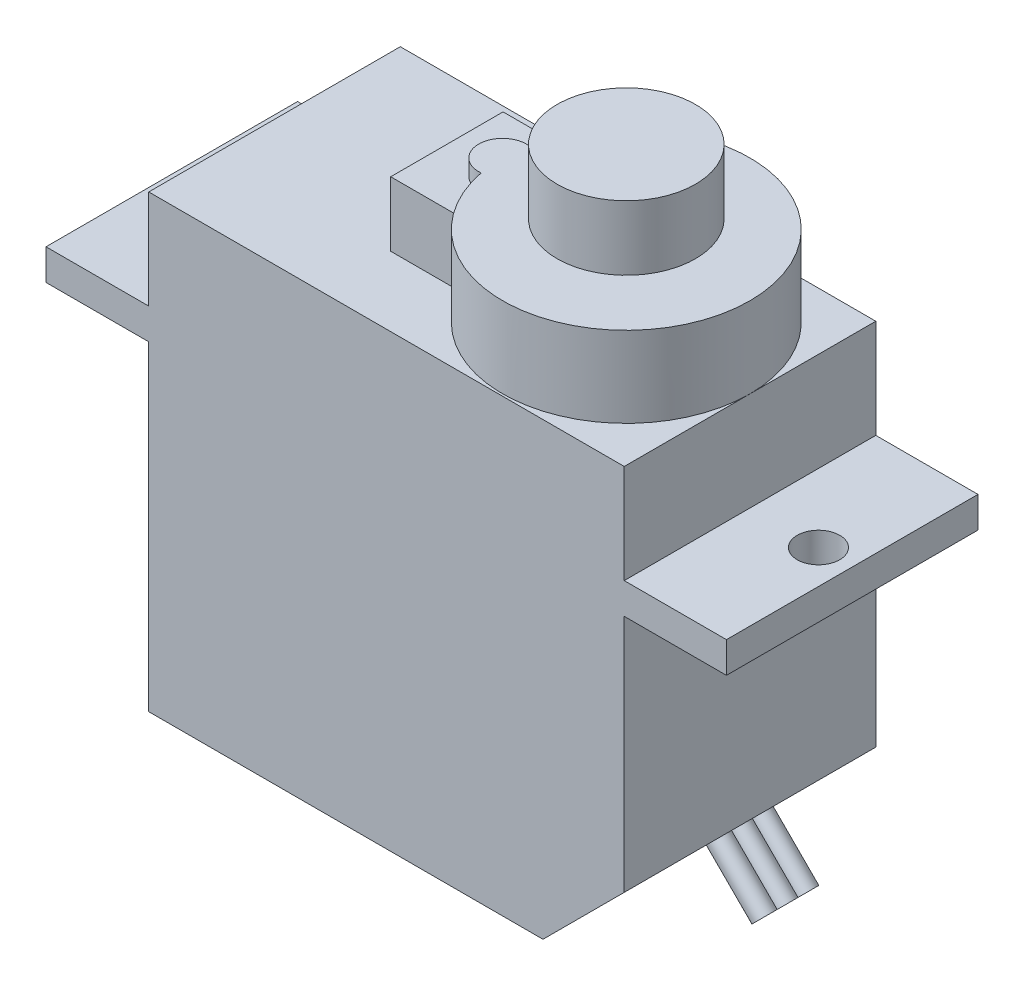
ISO-10303-21;
HEADER;
FILE_DESCRIPTION(('STEP AP214'),'2;1');
FILE_NAME('part.step','',(''),(''),'','','');
FILE_SCHEMA(('AUTOMOTIVE_DESIGN { 1 0 10303 214 1 1 1 1 }'));
ENDSEC;
DATA;
#1=APPLICATION_CONTEXT('core data for automotive mechanical design processes');
#2=APPLICATION_PROTOCOL_DEFINITION('international standard','automotive_design',2000,#1);
#3=PRODUCT_CONTEXT('',#1,'mechanical');
#4=PRODUCT('Part','Part','',(#3));
#5=PRODUCT_RELATED_PRODUCT_CATEGORY('part','',(#4));
#6=PRODUCT_DEFINITION_FORMATION('','',#4);
#7=PRODUCT_DEFINITION_CONTEXT('part definition',#1,'design');
#8=PRODUCT_DEFINITION('design','',#6,#7);
#9=PRODUCT_DEFINITION_SHAPE('','',#8);
#10=(LENGTH_UNIT() NAMED_UNIT(*) SI_UNIT(.MILLI.,.METRE.));
#11=(NAMED_UNIT(*) PLANE_ANGLE_UNIT() SI_UNIT($,.RADIAN.));
#12=(NAMED_UNIT(*) SI_UNIT($,.STERADIAN.) SOLID_ANGLE_UNIT());
#13=UNCERTAINTY_MEASURE_WITH_UNIT(LENGTH_MEASURE(1.E-05),#10,'distance_accuracy_value','');
#14=(GEOMETRIC_REPRESENTATION_CONTEXT(3) GLOBAL_UNCERTAINTY_ASSIGNED_CONTEXT((#13)) GLOBAL_UNIT_ASSIGNED_CONTEXT((#10,
#11,#12)) REPRESENTATION_CONTEXT('',''));
#15=CARTESIAN_POINT('',(0.,0.,0.));
#16=DIRECTION('',(0.,0.,1.));
#17=DIRECTION('',(1.,0.,0.));
#18=AXIS2_PLACEMENT_3D('',#15,#16,#17);
#19=CARTESIAN_POINT('',(19.12,0.,-12.2));
#20=DIRECTION('',(0.707106781186549,-0.707106781186546,0.));
#21=DIRECTION('',(0.707106781186546,0.707106781186549,0.));
#22=AXIS2_PLACEMENT_3D('',#19,#20,#21);
#23=PLANE('',#22);
#24=CARTESIAN_POINT('',(22.5615705813706,3.44157058137057,-6.1));
#25=DIRECTION('',(0.707106781186549,-0.707106781186546,0.));
#26=DIRECTION('',(0.707106781186546,0.707106781186549,0.));
#27=AXIS2_PLACEMENT_3D('',#24,#25,#26);
#28=CIRCLE('',#27,0.500000000000001);
#29=CARTESIAN_POINT('',(22.9151239719638,3.79512397196384,-6.1));
#30=VERTEX_POINT('',#29);
#31=EDGE_CURVE('E346',#30,#30,#28,.T.);
#32=ORIENTED_EDGE('',*,*,#31,.F.);
#33=EDGE_LOOP('',(#32));
#34=FACE_BOUND('',#33,.T.);
#35=DIRECTION('',(0.707106781186546,0.707106781186549,0.));
#36=VECTOR('',#35,1.);
#37=CARTESIAN_POINT('',(19.12,0.,0.));
#38=LINE('',#37,#36);
#39=CARTESIAN_POINT('',(19.12,0.,0.));
#40=VERTEX_POINT('',#39);
#41=CARTESIAN_POINT('',(23.06,3.94,0.));
#42=VERTEX_POINT('',#41);
#43=EDGE_CURVE('E297',#40,#42,#38,.T.);
#44=ORIENTED_EDGE('',*,*,#43,.F.);
#45=DIRECTION('',(0.,0.,1.));
#46=VECTOR('',#45,1.);
#47=CARTESIAN_POINT('',(19.12,0.,-12.2));
#48=LINE('',#47,#46);
#49=CARTESIAN_POINT('',(19.12,0.,-12.2));
#50=VERTEX_POINT('',#49);
#51=EDGE_CURVE('E316',#50,#40,#48,.T.);
#52=ORIENTED_EDGE('',*,*,#51,.F.);
#53=DIRECTION('',(0.707106781186546,0.707106781186549,0.));
#54=VECTOR('',#53,1.);
#55=CARTESIAN_POINT('',(19.12,0.,-12.2));
#56=LINE('',#55,#54);
#57=CARTESIAN_POINT('',(23.06,3.94,-12.2));
#58=VERTEX_POINT('',#57);
#59=EDGE_CURVE('E280',#50,#58,#56,.T.);
#60=ORIENTED_EDGE('',*,*,#59,.T.);
#61=DIRECTION('',(0.,0.,1.));
#62=VECTOR('',#61,1.);
#63=CARTESIAN_POINT('',(23.06,3.94,-12.2));
#64=LINE('',#63,#62);
#65=EDGE_CURVE('E314',#58,#42,#64,.T.);
#66=ORIENTED_EDGE('',*,*,#65,.T.);
#67=EDGE_LOOP('',(#44,#52,#60,#66));
#68=FACE_BOUND('',#67,.T.);
#69=CARTESIAN_POINT('',(22.5615705813706,3.44157058137056,-5.09));
#70=DIRECTION('',(0.707106781186549,-0.707106781186546,0.));
#71=DIRECTION('',(0.707106781186546,0.707106781186549,0.));
#72=AXIS2_PLACEMENT_3D('',#69,#70,#71);
#73=CIRCLE('',#72,0.500000000000001);
#74=CARTESIAN_POINT('',(22.9151239719638,3.79512397196384,-5.09));
#75=VERTEX_POINT('',#74);
#76=EDGE_CURVE('E340',#75,#75,#73,.T.);
#77=ORIENTED_EDGE('',*,*,#76,.F.);
#78=EDGE_LOOP('',(#77));
#79=FACE_BOUND('',#78,.T.);
#80=CARTESIAN_POINT('',(22.5615705813706,3.44157058137057,-7.11));
#81=DIRECTION('',(0.707106781186549,-0.707106781186546,0.));
#82=DIRECTION('',(0.707106781186546,0.707106781186549,0.));
#83=AXIS2_PLACEMENT_3D('',#80,#81,#82);
#84=CIRCLE('',#83,0.500000000000001);
#85=CARTESIAN_POINT('',(22.9151239719638,3.79512397196384,-7.11));
#86=VERTEX_POINT('',#85);
#87=EDGE_CURVE('E352',#86,#86,#84,.T.);
#88=ORIENTED_EDGE('',*,*,#87,.F.);
#89=EDGE_LOOP('',(#88));
#90=FACE_BOUND('',#89,.T.);
#91=ADVANCED_FACE('F33',(#34,#68,#79,#90),#23,.T.);
#92=CARTESIAN_POINT('',(17.06,28.51,-6.1));
#93=DIRECTION('',(0.,-1.,0.));
#94=DIRECTION('',(0.,0.,-1.));
#95=AXIS2_PLACEMENT_3D('',#92,#93,#94);
#96=CYLINDRICAL_SURFACE('',#95,2.345);
#97=CARTESIAN_POINT('',(17.06,25.74,-6.1));
#98=DIRECTION('',(0.,1.,0.));
#99=DIRECTION('',(0.,0.,1.));
#100=AXIS2_PLACEMENT_3D('',#97,#98,#99);
#101=CIRCLE('',#100,2.345);
#102=CARTESIAN_POINT('',(17.06,25.74,-3.755));
#103=VERTEX_POINT('',#102);
#104=EDGE_CURVE('E186',#103,#103,#101,.F.);
#105=ORIENTED_EDGE('',*,*,#104,.F.);
#106=EDGE_LOOP('',(#105));
#107=FACE_BOUND('',#106,.T.);
#108=CARTESIAN_POINT('',(17.06,26.18,-6.1));
#109=DIRECTION('',(0.,1.,0.));
#110=DIRECTION('',(0.,0.,1.));
#111=AXIS2_PLACEMENT_3D('',#108,#109,#110);
#112=CIRCLE('',#111,2.345);
#113=CARTESIAN_POINT('',(17.06,26.18,-3.755));
#114=VERTEX_POINT('',#113);
#115=EDGE_CURVE('E11',#114,#114,#112,.T.);
#116=ORIENTED_EDGE('',*,*,#115,.F.);
#117=EDGE_LOOP('',(#116));
#118=FACE_BOUND('',#117,.T.);
#119=ADVANCED_FACE('F368',(#107,#118),#96,.T.);
#120=CARTESIAN_POINT('',(17.06,25.74,-6.1));
#121=DIRECTION('',(0.,1.,0.));
#122=DIRECTION('',(0.,0.,1.));
#123=AXIS2_PLACEMENT_3D('',#120,#121,#122);
#124=PLANE('',#123);
#125=CARTESIAN_POINT('',(17.06,25.74,-6.1));
#126=DIRECTION('',(0.,1.,0.));
#127=DIRECTION('',(0.,0.,1.));
#128=AXIS2_PLACEMENT_3D('',#125,#126,#127);
#129=CIRCLE('',#128,6.);
#130=CARTESIAN_POINT('',(11.1721333333333,25.74,-4.94543249848458));
#131=VERTEX_POINT('',#130);
#132=CARTESIAN_POINT('',(11.1721333333333,25.74,-7.25456750151542));
#133=VERTEX_POINT('',#132);
#134=EDGE_CURVE('E265',#131,#133,#129,.T.);
#135=ORIENTED_EDGE('',*,*,#134,.T.);
#136=CARTESIAN_POINT('',(11.06,25.74,-6.1));
#137=DIRECTION('',(0.,1.,0.));
#138=DIRECTION('',(0.,0.,1.));
#139=AXIS2_PLACEMENT_3D('',#136,#137,#138);
#140=CIRCLE('',#139,1.16);
#141=EDGE_CURVE('E203',#133,#131,#140,.T.);
#142=ORIENTED_EDGE('',*,*,#141,.T.);
#143=EDGE_LOOP('',(#135,#142));
#144=FACE_BOUND('',#143,.T.);
#145=ORIENTED_EDGE('',*,*,#104,.T.);
#146=EDGE_LOOP('',(#145));
#147=FACE_BOUND('',#146,.T.);
#148=ADVANCED_FACE('F374',(#144,#147),#124,.T.);
#149=CARTESIAN_POINT('',(0.,21.83,-12.2));
#150=DIRECTION('',(0.,1.,0.));
#151=DIRECTION('',(0.,0.,1.));
#152=AXIS2_PLACEMENT_3D('',#149,#150,#151);
#153=PLANE('',#152);
#154=CARTESIAN_POINT('',(17.06,21.83,-6.1));
#155=DIRECTION('',(0.,1.,0.));
#156=DIRECTION('',(0.,0.,1.));
#157=AXIS2_PLACEMENT_3D('',#154,#155,#156);
#158=CIRCLE('',#157,6.);
#159=CARTESIAN_POINT('',(23.06,21.83,-6.1));
#160=VERTEX_POINT('',#159);
#161=CARTESIAN_POINT('',(11.7144995557011,21.83,-3.375));
#162=VERTEX_POINT('',#161);
#163=EDGE_CURVE('E269',#160,#162,#158,.F.);
#164=ORIENTED_EDGE('',*,*,#163,.T.);
#165=DIRECTION('',(-1.,0.,0.));
#166=VECTOR('',#165,1.);
#167=CARTESIAN_POINT('',(0.,21.83,-3.375));
#168=LINE('',#167,#166);
#169=CARTESIAN_POINT('',(8.36,21.83,-3.375));
#170=VERTEX_POINT('',#169);
#171=EDGE_CURVE('E201',#162,#170,#168,.T.);
#172=ORIENTED_EDGE('',*,*,#171,.T.);
#173=DIRECTION('',(0.,0.,-1.));
#174=VECTOR('',#173,1.);
#175=CARTESIAN_POINT('',(8.36,21.83,-12.2));
#176=LINE('',#175,#174);
#177=CARTESIAN_POINT('',(8.36,21.83,-8.825));
#178=VERTEX_POINT('',#177);
#179=EDGE_CURVE('E190',#170,#178,#176,.T.);
#180=ORIENTED_EDGE('',*,*,#179,.T.);
#181=DIRECTION('',(1.,0.,0.));
#182=VECTOR('',#181,1.);
#183=CARTESIAN_POINT('',(0.,21.83,-8.825));
#184=LINE('',#183,#182);
#185=CARTESIAN_POINT('',(11.7144995557011,21.83,-8.825));
#186=VERTEX_POINT('',#185);
#187=EDGE_CURVE('E198',#178,#186,#184,.T.);
#188=ORIENTED_EDGE('',*,*,#187,.T.);
#189=EDGE_CURVE('E268',#186,#160,#158,.F.);
#190=ORIENTED_EDGE('',*,*,#189,.T.);
#191=DIRECTION('',(0.,0.,1.));
#192=VECTOR('',#191,1.);
#193=CARTESIAN_POINT('',(23.06,21.83,-12.2));
#194=LINE('',#193,#192);
#195=CARTESIAN_POINT('',(23.06,21.83,-12.2));
#196=VERTEX_POINT('',#195);
#197=EDGE_CURVE('E310',#196,#160,#194,.T.);
#198=ORIENTED_EDGE('',*,*,#197,.F.);
#199=DIRECTION('',(-1.,0.,0.));
#200=VECTOR('',#199,1.);
#201=CARTESIAN_POINT('',(0.,21.83,-12.2));
#202=LINE('',#201,#200);
#203=CARTESIAN_POINT('',(0.,21.83,-12.2));
#204=VERTEX_POINT('',#203);
#205=EDGE_CURVE('E287',#196,#204,#202,.T.);
#206=ORIENTED_EDGE('',*,*,#205,.T.);
#207=DIRECTION('',(0.,0.,1.));
#208=VECTOR('',#207,1.);
#209=CARTESIAN_POINT('',(0.,21.83,-12.2));
#210=LINE('',#209,#208);
#211=CARTESIAN_POINT('',(0.,21.83,0.));
#212=VERTEX_POINT('',#211);
#213=EDGE_CURVE('E307',#204,#212,#210,.T.);
#214=ORIENTED_EDGE('',*,*,#213,.T.);
#215=DIRECTION('',(-1.,0.,0.));
#216=VECTOR('',#215,1.);
#217=CARTESIAN_POINT('',(0.,21.83,0.));
#218=LINE('',#217,#216);
#219=CARTESIAN_POINT('',(23.06,21.83,0.));
#220=VERTEX_POINT('',#219);
#221=EDGE_CURVE('E304',#220,#212,#218,.T.);
#222=ORIENTED_EDGE('',*,*,#221,.F.);
#223=EDGE_CURVE('E313',#160,#220,#194,.T.);
#224=ORIENTED_EDGE('',*,*,#223,.F.);
#225=EDGE_LOOP('',(#164,#172,#180,#188,#190,#198,#206,#214,#222,#224));
#226=FACE_BOUND('',#225,.T.);
#227=ADVANCED_FACE('F432',(#226),#153,.T.);
#228=CARTESIAN_POINT('',(17.06,25.74,-6.1));
#229=DIRECTION('',(0.,-1.,0.));
#230=DIRECTION('',(0.,0.,-1.));
#231=AXIS2_PLACEMENT_3D('',#228,#229,#230);
#232=CYLINDRICAL_SURFACE('',#231,6.);
#233=DIRECTION('',(0.,-1.,0.));
#234=VECTOR('',#233,1.);
#235=CARTESIAN_POINT('',(11.7144995557011,25.74,-8.825));
#236=LINE('',#235,#234);
#237=CARTESIAN_POINT('',(11.7144995557011,24.96,-8.825));
#238=VERTEX_POINT('',#237);
#239=EDGE_CURVE('E322',#238,#186,#236,.T.);
#240=ORIENTED_EDGE('',*,*,#239,.F.);
#241=CARTESIAN_POINT('',(17.06,24.96,-6.1));
#242=DIRECTION('',(0.,1.,0.));
#243=DIRECTION('',(0.,0.,1.));
#244=AXIS2_PLACEMENT_3D('',#241,#242,#243);
#245=CIRCLE('',#244,6.);
#246=CARTESIAN_POINT('',(11.1721333333333,24.96,-7.25456750151542));
#247=VERTEX_POINT('',#246);
#248=EDGE_CURVE('E193',#238,#247,#245,.T.);
#249=ORIENTED_EDGE('',*,*,#248,.T.);
#250=DIRECTION('',(0.,-1.,0.));
#251=VECTOR('',#250,1.);
#252=CARTESIAN_POINT('',(11.1721333333333,21.37,-7.25456750151542));
#253=LINE('',#252,#251);
#254=EDGE_CURVE('E206',#133,#247,#253,.T.);
#255=ORIENTED_EDGE('',*,*,#254,.F.);
#256=ORIENTED_EDGE('',*,*,#134,.F.);
#257=DIRECTION('',(0.,-1.,0.));
#258=VECTOR('',#257,1.);
#259=CARTESIAN_POINT('',(11.1721333333333,21.37,-4.94543249848458));
#260=LINE('',#259,#258);
#261=CARTESIAN_POINT('',(11.1721333333333,24.96,-4.94543249848458));
#262=VERTEX_POINT('',#261);
#263=EDGE_CURVE('E57',#262,#131,#260,.F.);
#264=ORIENTED_EDGE('',*,*,#263,.F.);
#265=CARTESIAN_POINT('',(11.7144995557011,24.96,-3.375));
#266=VERTEX_POINT('',#265);
#267=EDGE_CURVE('E50',#262,#266,#245,.T.);
#268=ORIENTED_EDGE('',*,*,#267,.T.);
#269=DIRECTION('',(0.,-1.,0.));
#270=VECTOR('',#269,1.);
#271=CARTESIAN_POINT('',(11.7144995557011,25.74,-3.375));
#272=LINE('',#271,#270);
#273=EDGE_CURVE('E176',#162,#266,#272,.F.);
#274=ORIENTED_EDGE('',*,*,#273,.F.);
#275=ORIENTED_EDGE('',*,*,#163,.F.);
#276=ORIENTED_EDGE('',*,*,#189,.F.);
#277=EDGE_LOOP('',(#240,#249,#255,#256,#264,#268,#274,#275,#276));
#278=FACE_BOUND('',#277,.T.);
#279=ADVANCED_FACE('F498',(#278),#232,.T.);
#280=CARTESIAN_POINT('',(0.,0.,-12.2));
#281=DIRECTION('',(-1.,0.,0.));
#282=DIRECTION('',(0.,0.,1.));
#283=AXIS2_PLACEMENT_3D('',#280,#281,#282);
#284=PLANE('',#283);
#285=DIRECTION('',(0.,0.,-1.));
#286=VECTOR('',#285,1.);
#287=CARTESIAN_POINT('',(0.,17.0352801000834,-12.2));
#288=LINE('',#287,#286);
#289=CARTESIAN_POINT('',(0.,17.0352801000834,0.));
#290=VERTEX_POINT('',#289);
#291=CARTESIAN_POINT('',(0.,17.0352801000834,-12.2));
#292=VERTEX_POINT('',#291);
#293=EDGE_CURVE('E263',#290,#292,#288,.T.);
#294=ORIENTED_EDGE('',*,*,#293,.F.);
#295=DIRECTION('',(0.,-1.,0.));
#296=VECTOR('',#295,1.);
#297=CARTESIAN_POINT('',(0.,0.,0.));
#298=LINE('',#297,#296);
#299=EDGE_CURVE('E291',#212,#290,#298,.T.);
#300=ORIENTED_EDGE('',*,*,#299,.F.);
#301=ORIENTED_EDGE('',*,*,#213,.F.);
#302=DIRECTION('',(0.,-1.,0.));
#303=VECTOR('',#302,1.);
#304=CARTESIAN_POINT('',(0.,0.,-12.2));
#305=LINE('',#304,#303);
#306=EDGE_CURVE('E273',#204,#292,#305,.T.);
#307=ORIENTED_EDGE('',*,*,#306,.T.);
#308=EDGE_LOOP('',(#294,#300,#301,#307));
#309=FACE_BOUND('',#308,.T.);
#310=ADVANCED_FACE('F438',(#309),#284,.T.);
#311=CARTESIAN_POINT('',(23.06,3.94,-12.2));
#312=DIRECTION('',(1.,0.,0.));
#313=DIRECTION('',(0.,0.,-1.));
#314=AXIS2_PLACEMENT_3D('',#311,#312,#313);
#315=PLANE('',#314);
#316=DIRECTION('',(0.,0.,1.));
#317=VECTOR('',#316,1.);
#318=CARTESIAN_POINT('',(23.06,17.0352801000834,-12.2));
#319=LINE('',#318,#317);
#320=CARTESIAN_POINT('',(23.06,17.0352801000834,-12.2));
#321=VERTEX_POINT('',#320);
#322=CARTESIAN_POINT('',(23.06,17.0352801000834,0.));
#323=VERTEX_POINT('',#322);
#324=EDGE_CURVE('E260',#321,#323,#319,.T.);
#325=ORIENTED_EDGE('',*,*,#324,.F.);
#326=DIRECTION('',(0.,1.,0.));
#327=VECTOR('',#326,1.);
#328=CARTESIAN_POINT('',(23.06,3.94,-12.2));
#329=LINE('',#328,#327);
#330=EDGE_CURVE('E283',#321,#196,#329,.T.);
#331=ORIENTED_EDGE('',*,*,#330,.T.);
#332=ORIENTED_EDGE('',*,*,#197,.T.);
#333=ORIENTED_EDGE('',*,*,#223,.T.);
#334=DIRECTION('',(0.,1.,0.));
#335=VECTOR('',#334,1.);
#336=CARTESIAN_POINT('',(23.06,3.94,0.));
#337=LINE('',#336,#335);
#338=EDGE_CURVE('E300',#323,#220,#337,.T.);
#339=ORIENTED_EDGE('',*,*,#338,.F.);
#340=EDGE_LOOP('',(#325,#331,#332,#333,#339));
#341=FACE_BOUND('',#340,.T.);
#342=ADVANCED_FACE('F394',(#341),#315,.T.);
#343=DIRECTION('',(0.,0.,1.));
#344=VECTOR('',#343,1.);
#345=CARTESIAN_POINT('',(0.,15.5352801000834,-12.2));
#346=LINE('',#345,#344);
#347=CARTESIAN_POINT('',(0.,15.5352801000834,-12.2));
#348=VERTEX_POINT('',#347);
#349=CARTESIAN_POINT('',(0.,15.5352801000834,0.));
#350=VERTEX_POINT('',#349);
#351=EDGE_CURVE('E257',#348,#350,#346,.T.);
#352=ORIENTED_EDGE('',*,*,#351,.F.);
#353=CARTESIAN_POINT('',(0.,0.,-12.2));
#354=VERTEX_POINT('',#353);
#355=EDGE_CURVE('E277',#348,#354,#305,.T.);
#356=ORIENTED_EDGE('',*,*,#355,.T.);
#357=DIRECTION('',(0.,0.,1.));
#358=VECTOR('',#357,1.);
#359=CARTESIAN_POINT('',(0.,0.,-12.2));
#360=LINE('',#359,#358);
#361=CARTESIAN_POINT('',(0.,0.,0.));
#362=VERTEX_POINT('',#361);
#363=EDGE_CURVE('E290',#354,#362,#360,.T.);
#364=ORIENTED_EDGE('',*,*,#363,.T.);
#365=EDGE_CURVE('E272',#350,#362,#298,.T.);
#366=ORIENTED_EDGE('',*,*,#365,.F.);
#367=EDGE_LOOP('',(#352,#356,#364,#366));
#368=FACE_BOUND('',#367,.T.);
#369=ADVANCED_FACE('F35',(#368),#284,.T.);
#370=DIRECTION('',(0.,0.,-1.));
#371=VECTOR('',#370,1.);
#372=CARTESIAN_POINT('',(23.06,15.5352801000834,-12.2));
#373=LINE('',#372,#371);
#374=CARTESIAN_POINT('',(23.06,15.5352801000834,0.));
#375=VERTEX_POINT('',#374);
#376=CARTESIAN_POINT('',(23.06,15.5352801000834,-12.2));
#377=VERTEX_POINT('',#376);
#378=EDGE_CURVE('E245',#375,#377,#373,.T.);
#379=ORIENTED_EDGE('',*,*,#378,.F.);
#380=EDGE_CURVE('E301',#42,#375,#337,.T.);
#381=ORIENTED_EDGE('',*,*,#380,.F.);
#382=ORIENTED_EDGE('',*,*,#65,.F.);
#383=EDGE_CURVE('E284',#58,#377,#329,.T.);
#384=ORIENTED_EDGE('',*,*,#383,.T.);
#385=EDGE_LOOP('',(#379,#381,#382,#384));
#386=FACE_BOUND('',#385,.T.);
#387=ADVANCED_FACE('F380',(#386),#315,.T.);
#388=CARTESIAN_POINT('',(0.,0.,-12.2));
#389=DIRECTION('',(0.,-1.,0.));
#390=DIRECTION('',(1.,0.,0.));
#391=AXIS2_PLACEMENT_3D('',#388,#389,#390);
#392=PLANE('',#391);
#393=DIRECTION('',(1.,0.,0.));
#394=VECTOR('',#393,1.);
#395=CARTESIAN_POINT('',(0.,0.,0.));
#396=LINE('',#395,#394);
#397=EDGE_CURVE('E294',#362,#40,#396,.T.);
#398=ORIENTED_EDGE('',*,*,#397,.F.);
#399=ORIENTED_EDGE('',*,*,#363,.F.);
#400=DIRECTION('',(1.,0.,0.));
#401=VECTOR('',#400,1.);
#402=CARTESIAN_POINT('',(0.,0.,-12.2));
#403=LINE('',#402,#401);
#404=EDGE_CURVE('E276',#354,#50,#403,.T.);
#405=ORIENTED_EDGE('',*,*,#404,.T.);
#406=ORIENTED_EDGE('',*,*,#51,.T.);
#407=EDGE_LOOP('',(#398,#399,#405,#406));
#408=FACE_BOUND('',#407,.T.);
#409=ADVANCED_FACE('F382',(#408),#392,.T.);
#410=CARTESIAN_POINT('',(0.,0.,-12.2));
#411=DIRECTION('',(0.,0.,-1.));
#412=DIRECTION('',(-1.,0.,0.));
#413=AXIS2_PLACEMENT_3D('',#410,#411,#412);
#414=PLANE('',#413);
#415=ORIENTED_EDGE('',*,*,#355,.F.);
#416=DIRECTION('',(1.,0.,0.));
#417=VECTOR('',#416,1.);
#418=CARTESIAN_POINT('',(-4.98290250208507,15.5352801000834,-12.2));
#419=LINE('',#418,#417);
#420=CARTESIAN_POINT('',(-4.98290250208507,15.5352801000834,-12.2));
#421=VERTEX_POINT('',#420);
#422=EDGE_CURVE('E223',#421,#348,#419,.T.);
#423=ORIENTED_EDGE('',*,*,#422,.F.);
#424=DIRECTION('',(0.,-1.,0.));
#425=VECTOR('',#424,1.);
#426=CARTESIAN_POINT('',(-4.98290250208507,15.5352801000834,-12.2));
#427=LINE('',#426,#425);
#428=CARTESIAN_POINT('',(-4.98290250208507,17.0352801000834,-12.2));
#429=VERTEX_POINT('',#428);
#430=EDGE_CURVE('E218',#429,#421,#427,.T.);
#431=ORIENTED_EDGE('',*,*,#430,.F.);
#432=DIRECTION('',(-1.,0.,0.));
#433=VECTOR('',#432,1.);
#434=CARTESIAN_POINT('',(-4.98290250208507,17.0352801000834,-12.2));
#435=LINE('',#434,#433);
#436=EDGE_CURVE('E228',#292,#429,#435,.T.);
#437=ORIENTED_EDGE('',*,*,#436,.F.);
#438=ORIENTED_EDGE('',*,*,#306,.F.);
#439=ORIENTED_EDGE('',*,*,#205,.F.);
#440=ORIENTED_EDGE('',*,*,#330,.F.);
#441=CARTESIAN_POINT('',(28.0170974979149,17.0352801000834,-12.2));
#442=VERTEX_POINT('',#441);
#443=EDGE_CURVE('E229',#442,#321,#435,.T.);
#444=ORIENTED_EDGE('',*,*,#443,.F.);
#445=DIRECTION('',(0.,1.,0.));
#446=VECTOR('',#445,1.);
#447=CARTESIAN_POINT('',(28.0170974979149,15.5352801000834,-12.2));
#448=LINE('',#447,#446);
#449=CARTESIAN_POINT('',(28.0170974979149,15.5352801000834,-12.2));
#450=VERTEX_POINT('',#449);
#451=EDGE_CURVE('E225',#450,#442,#448,.T.);
#452=ORIENTED_EDGE('',*,*,#451,.F.);
#453=EDGE_CURVE('E221',#377,#450,#419,.T.);
#454=ORIENTED_EDGE('',*,*,#453,.F.);
#455=ORIENTED_EDGE('',*,*,#383,.F.);
#456=ORIENTED_EDGE('',*,*,#59,.F.);
#457=ORIENTED_EDGE('',*,*,#404,.F.);
#458=EDGE_LOOP('',(#415,#423,#431,#437,#438,#439,#440,#444,#452,#454,#455,#456,#457));
#459=FACE_BOUND('',#458,.T.);
#460=ADVANCED_FACE('F384',(#459),#414,.T.);
#461=CARTESIAN_POINT('',(0.,0.,0.));
#462=DIRECTION('',(0.,0.,-1.));
#463=DIRECTION('',(-1.,0.,0.));
#464=AXIS2_PLACEMENT_3D('',#461,#462,#463);
#465=PLANE('',#464);
#466=ORIENTED_EDGE('',*,*,#380,.T.);
#467=DIRECTION('',(1.,0.,0.));
#468=VECTOR('',#467,1.);
#469=CARTESIAN_POINT('',(-4.98290250208507,15.5352801000834,0.));
#470=LINE('',#469,#468);
#471=CARTESIAN_POINT('',(28.0170974979149,15.5352801000834,0.));
#472=VERTEX_POINT('',#471);
#473=EDGE_CURVE('E234',#375,#472,#470,.T.);
#474=ORIENTED_EDGE('',*,*,#473,.T.);
#475=DIRECTION('',(0.,1.,0.));
#476=VECTOR('',#475,1.);
#477=CARTESIAN_POINT('',(28.0170974979149,15.5352801000834,0.));
#478=LINE('',#477,#476);
#479=CARTESIAN_POINT('',(28.0170974979149,17.0352801000834,0.));
#480=VERTEX_POINT('',#479);
#481=EDGE_CURVE('E237',#472,#480,#478,.T.);
#482=ORIENTED_EDGE('',*,*,#481,.T.);
#483=DIRECTION('',(-1.,0.,0.));
#484=VECTOR('',#483,1.);
#485=CARTESIAN_POINT('',(-4.98290250208507,17.0352801000834,0.));
#486=LINE('',#485,#484);
#487=EDGE_CURVE('E222',#480,#323,#486,.T.);
#488=ORIENTED_EDGE('',*,*,#487,.T.);
#489=ORIENTED_EDGE('',*,*,#338,.T.);
#490=ORIENTED_EDGE('',*,*,#221,.T.);
#491=ORIENTED_EDGE('',*,*,#299,.T.);
#492=CARTESIAN_POINT('',(-4.98290250208507,17.0352801000834,0.));
#493=VERTEX_POINT('',#492);
#494=EDGE_CURVE('E240',#290,#493,#486,.T.);
#495=ORIENTED_EDGE('',*,*,#494,.T.);
#496=DIRECTION('',(0.,-1.,0.));
#497=VECTOR('',#496,1.);
#498=CARTESIAN_POINT('',(-4.98290250208507,15.5352801000834,0.));
#499=LINE('',#498,#497);
#500=CARTESIAN_POINT('',(-4.98290250208507,15.5352801000834,0.));
#501=VERTEX_POINT('',#500);
#502=EDGE_CURVE('E217',#493,#501,#499,.T.);
#503=ORIENTED_EDGE('',*,*,#502,.T.);
#504=EDGE_CURVE('E235',#501,#350,#470,.T.);
#505=ORIENTED_EDGE('',*,*,#504,.T.);
#506=ORIENTED_EDGE('',*,*,#365,.T.);
#507=ORIENTED_EDGE('',*,*,#397,.T.);
#508=ORIENTED_EDGE('',*,*,#43,.T.);
#509=EDGE_LOOP('',(#466,#474,#482,#488,#489,#490,#491,#495,#503,#505,#506,#507,#508));
#510=FACE_BOUND('',#509,.T.);
#511=ADVANCED_FACE('F390',(#510),#465,.F.);
#512=CARTESIAN_POINT('',(26.38,0.,-6.1));
#513=DIRECTION('',(0.,1.,0.));
#514=DIRECTION('',(0.,0.,1.));
#515=AXIS2_PLACEMENT_3D('',#512,#513,#514);
#516=CYLINDRICAL_SURFACE('',#515,1.03);
#517=CARTESIAN_POINT('',(26.38,17.0352801000834,-6.1));
#518=DIRECTION('',(0.,1.,0.));
#519=DIRECTION('',(0.,0.,1.));
#520=AXIS2_PLACEMENT_3D('',#517,#518,#519);
#521=CIRCLE('',#520,1.03);
#522=CARTESIAN_POINT('',(26.38,17.0352801000834,-5.07));
#523=VERTEX_POINT('',#522);
#524=EDGE_CURVE('E210',#523,#523,#521,.T.);
#525=ORIENTED_EDGE('',*,*,#524,.T.);
#526=EDGE_LOOP('',(#525));
#527=FACE_BOUND('',#526,.T.);
#528=CARTESIAN_POINT('',(26.38,15.5352801000834,-6.1));
#529=DIRECTION('',(0.,-1.,0.));
#530=DIRECTION('',(0.,0.,-1.));
#531=AXIS2_PLACEMENT_3D('',#528,#529,#530);
#532=CIRCLE('',#531,1.03);
#533=CARTESIAN_POINT('',(26.38,15.5352801000834,-7.13));
#534=VERTEX_POINT('',#533);
#535=EDGE_CURVE('E209',#534,#534,#532,.T.);
#536=ORIENTED_EDGE('',*,*,#535,.T.);
#537=EDGE_LOOP('',(#536));
#538=FACE_BOUND('',#537,.T.);
#539=ADVANCED_FACE('F468',(#527,#538),#516,.F.);
#540=CARTESIAN_POINT('',(28.0170974979149,15.5352801000834,-12.2));
#541=DIRECTION('',(1.,0.,0.));
#542=DIRECTION('',(0.,0.,-1.));
#543=AXIS2_PLACEMENT_3D('',#540,#541,#542);
#544=PLANE('',#543);
#545=ORIENTED_EDGE('',*,*,#481,.F.);
#546=DIRECTION('',(0.,0.,1.));
#547=VECTOR('',#546,1.);
#548=CARTESIAN_POINT('',(28.0170974979149,15.5352801000834,-12.2));
#549=LINE('',#548,#547);
#550=EDGE_CURVE('E248',#450,#472,#549,.T.);
#551=ORIENTED_EDGE('',*,*,#550,.F.);
#552=ORIENTED_EDGE('',*,*,#451,.T.);
#553=DIRECTION('',(0.,0.,1.));
#554=VECTOR('',#553,1.);
#555=CARTESIAN_POINT('',(28.0170974979149,17.0352801000834,-12.2));
#556=LINE('',#555,#554);
#557=EDGE_CURVE('E246',#442,#480,#556,.T.);
#558=ORIENTED_EDGE('',*,*,#557,.T.);
#559=EDGE_LOOP('',(#545,#551,#552,#558));
#560=FACE_BOUND('',#559,.T.);
#561=ADVANCED_FACE('F420',(#560),#544,.T.);
#562=CARTESIAN_POINT('',(-4.98290250208507,15.5352801000834,-12.2));
#563=DIRECTION('',(0.,-1.,0.));
#564=DIRECTION('',(0.,0.,-1.));
#565=AXIS2_PLACEMENT_3D('',#562,#563,#564);
#566=PLANE('',#565);
#567=ORIENTED_EDGE('',*,*,#535,.F.);
#568=EDGE_LOOP('',(#567));
#569=FACE_BOUND('',#568,.T.);
#570=ORIENTED_EDGE('',*,*,#473,.F.);
#571=ORIENTED_EDGE('',*,*,#378,.T.);
#572=ORIENTED_EDGE('',*,*,#453,.T.);
#573=ORIENTED_EDGE('',*,*,#550,.T.);
#574=EDGE_LOOP('',(#570,#571,#572,#573));
#575=FACE_BOUND('',#574,.T.);
#576=ADVANCED_FACE('F417',(#569,#575),#566,.T.);
#577=CARTESIAN_POINT('',(-4.98290250208507,17.0352801000834,-12.2));
#578=DIRECTION('',(0.,1.,0.));
#579=DIRECTION('',(0.,0.,1.));
#580=AXIS2_PLACEMENT_3D('',#577,#578,#579);
#581=PLANE('',#580);
#582=ORIENTED_EDGE('',*,*,#524,.F.);
#583=EDGE_LOOP('',(#582));
#584=FACE_BOUND('',#583,.T.);
#585=ORIENTED_EDGE('',*,*,#443,.T.);
#586=ORIENTED_EDGE('',*,*,#324,.T.);
#587=ORIENTED_EDGE('',*,*,#487,.F.);
#588=ORIENTED_EDGE('',*,*,#557,.F.);
#589=EDGE_LOOP('',(#585,#586,#587,#588));
#590=FACE_BOUND('',#589,.T.);
#591=ADVANCED_FACE('F423',(#584,#590),#581,.T.);
#592=CARTESIAN_POINT('',(-3.31,17.0352801000834,-6.1));
#593=DIRECTION('',(0.,1.,0.));
#594=DIRECTION('',(0.,0.,1.));
#595=AXIS2_PLACEMENT_3D('',#592,#593,#594);
#596=CIRCLE('',#595,1.03);
#597=CARTESIAN_POINT('',(-3.31,17.0352801000834,-5.07));
#598=VERTEX_POINT('',#597);
#599=EDGE_CURVE('E214',#598,#598,#596,.T.);
#600=ORIENTED_EDGE('',*,*,#599,.F.);
#601=EDGE_LOOP('',(#600));
#602=FACE_BOUND('',#601,.T.);
#603=ORIENTED_EDGE('',*,*,#494,.F.);
#604=ORIENTED_EDGE('',*,*,#293,.T.);
#605=ORIENTED_EDGE('',*,*,#436,.T.);
#606=DIRECTION('',(0.,0.,1.));
#607=VECTOR('',#606,1.);
#608=CARTESIAN_POINT('',(-4.98290250208507,17.0352801000834,-12.2));
#609=LINE('',#608,#607);
#610=EDGE_CURVE('E242',#429,#493,#609,.T.);
#611=ORIENTED_EDGE('',*,*,#610,.T.);
#612=EDGE_LOOP('',(#603,#604,#605,#611));
#613=FACE_BOUND('',#612,.T.);
#614=ADVANCED_FACE('F442',(#602,#613),#581,.T.);
#615=CARTESIAN_POINT('',(-3.31,15.5352801000834,-6.1));
#616=DIRECTION('',(0.,-1.,0.));
#617=DIRECTION('',(0.,0.,-1.));
#618=AXIS2_PLACEMENT_3D('',#615,#616,#617);
#619=CIRCLE('',#618,1.03);
#620=CARTESIAN_POINT('',(-3.31,15.5352801000834,-7.13));
#621=VERTEX_POINT('',#620);
#622=EDGE_CURVE('E213',#621,#621,#619,.T.);
#623=ORIENTED_EDGE('',*,*,#622,.F.);
#624=EDGE_LOOP('',(#623));
#625=FACE_BOUND('',#624,.T.);
#626=ORIENTED_EDGE('',*,*,#422,.T.);
#627=ORIENTED_EDGE('',*,*,#351,.T.);
#628=ORIENTED_EDGE('',*,*,#504,.F.);
#629=DIRECTION('',(0.,0.,1.));
#630=VECTOR('',#629,1.);
#631=CARTESIAN_POINT('',(-4.98290250208507,15.5352801000834,-12.2));
#632=LINE('',#631,#630);
#633=EDGE_CURVE('E231',#421,#501,#632,.T.);
#634=ORIENTED_EDGE('',*,*,#633,.F.);
#635=EDGE_LOOP('',(#626,#627,#628,#634));
#636=FACE_BOUND('',#635,.T.);
#637=ADVANCED_FACE('F447',(#625,#636),#566,.T.);
#638=CARTESIAN_POINT('',(-4.98290250208507,15.5352801000834,-12.2));
#639=DIRECTION('',(-1.,0.,0.));
#640=DIRECTION('',(0.,0.,1.));
#641=AXIS2_PLACEMENT_3D('',#638,#639,#640);
#642=PLANE('',#641);
#643=ORIENTED_EDGE('',*,*,#502,.F.);
#644=ORIENTED_EDGE('',*,*,#610,.F.);
#645=ORIENTED_EDGE('',*,*,#430,.T.);
#646=ORIENTED_EDGE('',*,*,#633,.T.);
#647=EDGE_LOOP('',(#643,#644,#645,#646));
#648=FACE_BOUND('',#647,.T.);
#649=ADVANCED_FACE('F445',(#648),#642,.T.);
#650=CARTESIAN_POINT('',(-3.31,0.,-6.1));
#651=DIRECTION('',(0.,1.,0.));
#652=DIRECTION('',(0.,0.,1.));
#653=AXIS2_PLACEMENT_3D('',#650,#651,#652);
#654=CYLINDRICAL_SURFACE('',#653,1.03);
#655=ORIENTED_EDGE('',*,*,#599,.T.);
#656=EDGE_LOOP('',(#655));
#657=FACE_BOUND('',#656,.T.);
#658=ORIENTED_EDGE('',*,*,#622,.T.);
#659=EDGE_LOOP('',(#658));
#660=FACE_BOUND('',#659,.T.);
#661=ADVANCED_FACE('F455',(#657,#660),#654,.F.);
#662=CARTESIAN_POINT('',(11.06,25.74,-6.1));
#663=DIRECTION('',(0.,-1.,0.));
#664=DIRECTION('',(0.,0.,-1.));
#665=AXIS2_PLACEMENT_3D('',#662,#663,#664);
#666=CYLINDRICAL_SURFACE('',#665,1.16);
#667=ORIENTED_EDGE('',*,*,#254,.T.);
#668=CARTESIAN_POINT('',(11.06,24.96,-6.1));
#669=DIRECTION('',(0.,1.,0.));
#670=DIRECTION('',(0.,0.,1.));
#671=AXIS2_PLACEMENT_3D('',#668,#669,#670);
#672=CIRCLE('',#671,1.16);
#673=EDGE_CURVE('E309',#247,#262,#672,.T.);
#674=ORIENTED_EDGE('',*,*,#673,.T.);
#675=ORIENTED_EDGE('',*,*,#263,.T.);
#676=ORIENTED_EDGE('',*,*,#141,.F.);
#677=EDGE_LOOP('',(#667,#674,#675,#676));
#678=FACE_BOUND('',#677,.T.);
#679=ADVANCED_FACE('F480',(#678),#666,.T.);
#680=CARTESIAN_POINT('',(0.,24.96,0.));
#681=DIRECTION('',(0.,1.,0.));
#682=DIRECTION('',(0.,0.,1.));
#683=AXIS2_PLACEMENT_3D('',#680,#681,#682);
#684=PLANE('',#683);
#685=ORIENTED_EDGE('',*,*,#248,.F.);
#686=DIRECTION('',(-1.,0.,0.));
#687=VECTOR('',#686,1.);
#688=CARTESIAN_POINT('',(13.76,24.96,-8.825));
#689=LINE('',#688,#687);
#690=CARTESIAN_POINT('',(8.36,24.96,-8.825));
#691=VERTEX_POINT('',#690);
#692=EDGE_CURVE('E177',#238,#691,#689,.T.);
#693=ORIENTED_EDGE('',*,*,#692,.T.);
#694=DIRECTION('',(0.,0.,1.));
#695=VECTOR('',#694,1.);
#696=CARTESIAN_POINT('',(8.36,24.96,-3.375));
#697=LINE('',#696,#695);
#698=CARTESIAN_POINT('',(8.36,24.96,-3.375));
#699=VERTEX_POINT('',#698);
#700=EDGE_CURVE('E178',#691,#699,#697,.T.);
#701=ORIENTED_EDGE('',*,*,#700,.T.);
#702=DIRECTION('',(1.,0.,0.));
#703=VECTOR('',#702,1.);
#704=CARTESIAN_POINT('',(13.76,24.96,-3.375));
#705=LINE('',#704,#703);
#706=EDGE_CURVE('E169',#699,#266,#705,.T.);
#707=ORIENTED_EDGE('',*,*,#706,.T.);
#708=ORIENTED_EDGE('',*,*,#267,.F.);
#709=ORIENTED_EDGE('',*,*,#673,.F.);
#710=EDGE_LOOP('',(#685,#693,#701,#707,#708,#709));
#711=FACE_BOUND('',#710,.T.);
#712=ADVANCED_FACE('F181',(#711),#684,.T.);
#713=CARTESIAN_POINT('',(8.36,24.96,-3.375));
#714=DIRECTION('',(1.,0.,0.));
#715=DIRECTION('',(0.,0.,-1.));
#716=AXIS2_PLACEMENT_3D('',#713,#714,#715);
#717=PLANE('',#716);
#718=ORIENTED_EDGE('',*,*,#179,.F.);
#719=DIRECTION('',(0.,-1.,0.));
#720=VECTOR('',#719,1.);
#721=CARTESIAN_POINT('',(8.36,24.96,-3.375));
#722=LINE('',#721,#720);
#723=EDGE_CURVE('E173',#699,#170,#722,.T.);
#724=ORIENTED_EDGE('',*,*,#723,.F.);
#725=ORIENTED_EDGE('',*,*,#700,.F.);
#726=DIRECTION('',(0.,-1.,0.));
#727=VECTOR('',#726,1.);
#728=CARTESIAN_POINT('',(8.36,24.96,-8.825));
#729=LINE('',#728,#727);
#730=EDGE_CURVE('E191',#691,#178,#729,.T.);
#731=ORIENTED_EDGE('',*,*,#730,.T.);
#732=EDGE_LOOP('',(#718,#724,#725,#731));
#733=FACE_BOUND('',#732,.T.);
#734=ADVANCED_FACE('F188',(#733),#717,.F.);
#735=CARTESIAN_POINT('',(13.76,24.96,-3.375));
#736=DIRECTION('',(0.,0.,-1.));
#737=DIRECTION('',(-1.,0.,0.));
#738=AXIS2_PLACEMENT_3D('',#735,#736,#737);
#739=PLANE('',#738);
#740=ORIENTED_EDGE('',*,*,#171,.F.);
#741=ORIENTED_EDGE('',*,*,#273,.T.);
#742=ORIENTED_EDGE('',*,*,#706,.F.);
#743=ORIENTED_EDGE('',*,*,#723,.T.);
#744=EDGE_LOOP('',(#740,#741,#742,#743));
#745=FACE_BOUND('',#744,.T.);
#746=ADVANCED_FACE('F171',(#745),#739,.F.);
#747=CARTESIAN_POINT('',(13.76,24.96,-8.825));
#748=DIRECTION('',(0.,0.,1.));
#749=DIRECTION('',(1.,0.,0.));
#750=AXIS2_PLACEMENT_3D('',#747,#748,#749);
#751=PLANE('',#750);
#752=ORIENTED_EDGE('',*,*,#187,.F.);
#753=ORIENTED_EDGE('',*,*,#730,.F.);
#754=ORIENTED_EDGE('',*,*,#692,.F.);
#755=ORIENTED_EDGE('',*,*,#239,.T.);
#756=EDGE_LOOP('',(#752,#753,#754,#755));
#757=FACE_BOUND('',#756,.T.);
#758=ADVANCED_FACE('F614',(#757),#751,.F.);
#759=CARTESIAN_POINT('',(17.06,26.18,-6.1));
#760=DIRECTION('',(0.,1.,0.));
#761=DIRECTION('',(0.,0.,1.));
#762=AXIS2_PLACEMENT_3D('',#759,#760,#761);
#763=PLANE('',#762);
#764=CARTESIAN_POINT('',(17.06,26.18,-6.1));
#765=DIRECTION('',(0.,1.,0.));
#766=DIRECTION('',(0.,0.,1.));
#767=AXIS2_PLACEMENT_3D('',#764,#765,#766);
#768=CIRCLE('',#767,3.355);
#769=CARTESIAN_POINT('',(17.06,26.18,-2.745));
#770=VERTEX_POINT('',#769);
#771=EDGE_CURVE('E329',#770,#770,#768,.T.);
#772=ORIENTED_EDGE('',*,*,#771,.F.);
#773=EDGE_LOOP('',(#772));
#774=FACE_BOUND('',#773,.T.);
#775=ORIENTED_EDGE('',*,*,#115,.T.);
#776=EDGE_LOOP('',(#775));
#777=FACE_BOUND('',#776,.T.);
#778=ADVANCED_FACE('F622',(#774,#777),#763,.F.);
#779=CARTESIAN_POINT('',(17.06,26.18,-6.1));
#780=DIRECTION('',(0.,1.,0.));
#781=DIRECTION('',(0.,0.,1.));
#782=AXIS2_PLACEMENT_3D('',#779,#780,#781);
#783=CYLINDRICAL_SURFACE('',#782,3.355);
#784=ORIENTED_EDGE('',*,*,#771,.T.);
#785=EDGE_LOOP('',(#784));
#786=FACE_BOUND('',#785,.T.);
#787=CARTESIAN_POINT('',(17.06,29.31,-6.1));
#788=DIRECTION('',(0.,1.,0.));
#789=DIRECTION('',(0.,0.,1.));
#790=AXIS2_PLACEMENT_3D('',#787,#788,#789);
#791=CIRCLE('',#790,3.355);
#792=CARTESIAN_POINT('',(17.06,29.31,-2.745));
#793=VERTEX_POINT('',#792);
#794=EDGE_CURVE('E334',#793,#793,#791,.T.);
#795=ORIENTED_EDGE('',*,*,#794,.F.);
#796=EDGE_LOOP('',(#795));
#797=FACE_BOUND('',#796,.T.);
#798=ADVANCED_FACE('F659',(#786,#797),#783,.T.);
#799=CARTESIAN_POINT('',(17.06,29.31,-6.1));
#800=DIRECTION('',(0.,1.,0.));
#801=DIRECTION('',(0.,0.,1.));
#802=AXIS2_PLACEMENT_3D('',#799,#800,#801);
#803=PLANE('',#802);
#804=ORIENTED_EDGE('',*,*,#794,.T.);
#805=EDGE_LOOP('',(#804));
#806=FACE_BOUND('',#805,.T.);
#807=ADVANCED_FACE('F669',(#806),#803,.T.);
#808=CARTESIAN_POINT('',(24.7748148064845,1.22832635625667,-5.09));
#809=DIRECTION('',(-0.707106781186549,0.707106781186546,0.));
#810=DIRECTION('',(-0.707106781186546,-0.707106781186549,0.));
#811=AXIS2_PLACEMENT_3D('',#808,#809,#810);
#812=CYLINDRICAL_SURFACE('',#811,0.500000000000001);
#813=CARTESIAN_POINT('',(24.7748148064845,1.22832635625667,-5.09));
#814=DIRECTION('',(0.707106781186549,-0.707106781186546,0.));
#815=DIRECTION('',(0.707106781186546,0.707106781186549,0.));
#816=AXIS2_PLACEMENT_3D('',#813,#814,#815);
#817=CIRCLE('',#816,0.500000000000001);
#818=CARTESIAN_POINT('',(25.1283681970777,1.58187974684995,-5.09));
#819=VERTEX_POINT('',#818);
#820=EDGE_CURVE('E338',#819,#819,#817,.T.);
#821=ORIENTED_EDGE('',*,*,#820,.F.);
#822=EDGE_LOOP('',(#821));
#823=FACE_BOUND('',#822,.T.);
#824=ORIENTED_EDGE('',*,*,#76,.T.);
#825=EDGE_LOOP('',(#824));
#826=FACE_BOUND('',#825,.T.);
#827=ADVANCED_FACE('F679',(#823,#826),#812,.T.);
#828=CARTESIAN_POINT('',(24.7748148064845,1.22832635625667,-5.09));
#829=DIRECTION('',(0.707106781186549,-0.707106781186546,0.));
#830=DIRECTION('',(0.707106781186546,0.707106781186549,0.));
#831=AXIS2_PLACEMENT_3D('',#828,#829,#830);
#832=PLANE('',#831);
#833=ORIENTED_EDGE('',*,*,#820,.T.);
#834=EDGE_LOOP('',(#833));
#835=FACE_BOUND('',#834,.T.);
#836=ADVANCED_FACE('F708',(#835),#832,.T.);
#837=CARTESIAN_POINT('',(24.7748148064845,1.22832635625668,-6.1));
#838=DIRECTION('',(-0.707106781186549,0.707106781186546,0.));
#839=DIRECTION('',(-0.707106781186546,-0.707106781186549,0.));
#840=AXIS2_PLACEMENT_3D('',#837,#838,#839);
#841=CYLINDRICAL_SURFACE('',#840,0.500000000000001);
#842=CARTESIAN_POINT('',(24.7748148064845,1.22832635625668,-6.1));
#843=DIRECTION('',(0.707106781186549,-0.707106781186546,0.));
#844=DIRECTION('',(0.707106781186546,0.707106781186549,0.));
#845=AXIS2_PLACEMENT_3D('',#842,#843,#844);
#846=CIRCLE('',#845,0.500000000000001);
#847=CARTESIAN_POINT('',(25.1283681970777,1.58187974684995,-6.1));
#848=VERTEX_POINT('',#847);
#849=EDGE_CURVE('E343',#848,#848,#846,.T.);
#850=ORIENTED_EDGE('',*,*,#849,.F.);
#851=EDGE_LOOP('',(#850));
#852=FACE_BOUND('',#851,.T.);
#853=ORIENTED_EDGE('',*,*,#31,.T.);
#854=EDGE_LOOP('',(#853));
#855=FACE_BOUND('',#854,.T.);
#856=ADVANCED_FACE('F718',(#852,#855),#841,.T.);
#857=CARTESIAN_POINT('',(24.7748148064845,1.22832635625668,-6.1));
#858=DIRECTION('',(0.707106781186549,-0.707106781186546,0.));
#859=DIRECTION('',(0.707106781186546,0.707106781186549,0.));
#860=AXIS2_PLACEMENT_3D('',#857,#858,#859);
#861=PLANE('',#860);
#862=ORIENTED_EDGE('',*,*,#849,.T.);
#863=EDGE_LOOP('',(#862));
#864=FACE_BOUND('',#863,.T.);
#865=ADVANCED_FACE('F363',(#864),#861,.T.);
#866=CARTESIAN_POINT('',(24.7748148064845,1.22832635625668,-7.11));
#867=DIRECTION('',(-0.707106781186549,0.707106781186546,0.));
#868=DIRECTION('',(-0.707106781186546,-0.707106781186549,0.));
#869=AXIS2_PLACEMENT_3D('',#866,#867,#868);
#870=CYLINDRICAL_SURFACE('',#869,0.500000000000001);
#871=CARTESIAN_POINT('',(24.7748148064845,1.22832635625668,-7.11));
#872=DIRECTION('',(0.707106781186549,-0.707106781186546,0.));
#873=DIRECTION('',(0.707106781186546,0.707106781186549,0.));
#874=AXIS2_PLACEMENT_3D('',#871,#872,#873);
#875=CIRCLE('',#874,0.500000000000001);
#876=CARTESIAN_POINT('',(25.1283681970777,1.58187974684995,-7.11));
#877=VERTEX_POINT('',#876);
#878=EDGE_CURVE('E349',#877,#877,#875,.T.);
#879=ORIENTED_EDGE('',*,*,#878,.F.);
#880=EDGE_LOOP('',(#879));
#881=FACE_BOUND('',#880,.T.);
#882=ORIENTED_EDGE('',*,*,#87,.T.);
#883=EDGE_LOOP('',(#882));
#884=FACE_BOUND('',#883,.T.);
#885=ADVANCED_FACE('F360',(#881,#884),#870,.T.);
#886=CARTESIAN_POINT('',(24.7748148064845,1.22832635625668,-7.11));
#887=DIRECTION('',(0.707106781186549,-0.707106781186546,0.));
#888=DIRECTION('',(0.707106781186546,0.707106781186549,0.));
#889=AXIS2_PLACEMENT_3D('',#886,#887,#888);
#890=PLANE('',#889);
#891=ORIENTED_EDGE('',*,*,#878,.T.);
#892=EDGE_LOOP('',(#891));
#893=FACE_BOUND('',#892,.T.);
#894=ADVANCED_FACE('F358',(#893),#890,.T.);
#895=CLOSED_SHELL('',(#91,#119,#148,#227,#279,#310,#342,#369,#387,#409,#460,#511,#539,#561,#576,
#591,#614,#637,#649,#661,#679,#712,#734,#746,#758,#778,#798,#807,#827,#836,#856,#865,#885,#894));
#896=CARTESIAN_POINT('',(17.06,26.18,-6.1));
#897=DIRECTION('',(0.,1.,0.));
#898=DIRECTION('',(0.,0.,1.));
#899=AXIS2_PLACEMENT_3D('',#896,#897,#898);
#900=CIRCLE('',#899,0.634999999999999);
#901=CARTESIAN_POINT('',(17.06,26.18,-5.465));
#902=VERTEX_POINT('',#901);
#903=EDGE_CURVE('E37',#902,#902,#900,.F.);
#904=ORIENTED_EDGE('',*,*,#903,.T.);
#905=EDGE_LOOP('',(#904));
#906=FACE_BOUND('',#905,.T.);
#907=ADVANCED_FACE('F641',(#906),#763,.F.);
#908=CARTESIAN_POINT('',(17.06,25.38,-6.1));
#909=DIRECTION('',(0.,1.,0.));
#910=DIRECTION('',(0.,0.,1.));
#911=AXIS2_PLACEMENT_3D('',#908,#909,#910);
#912=PLANE('',#911);
#913=CARTESIAN_POINT('',(17.06,25.38,-6.1));
#914=DIRECTION('',(0.,1.,0.));
#915=DIRECTION('',(0.,0.,1.));
#916=AXIS2_PLACEMENT_3D('',#913,#914,#915);
#917=CIRCLE('',#916,0.634999999999999);
#918=CARTESIAN_POINT('',(17.06,25.38,-5.465));
#919=VERTEX_POINT('',#918);
#920=EDGE_CURVE('E325',#919,#919,#917,.T.);
#921=ORIENTED_EDGE('',*,*,#920,.T.);
#922=EDGE_LOOP('',(#921));
#923=FACE_BOUND('',#922,.T.);
#924=ADVANCED_FACE('F636',(#923),#912,.T.);
#925=CARTESIAN_POINT('',(17.06,25.38,-6.1));
#926=DIRECTION('',(0.,1.,0.));
#927=DIRECTION('',(0.,0.,1.));
#928=AXIS2_PLACEMENT_3D('',#925,#926,#927);
#929=CYLINDRICAL_SURFACE('',#928,0.634999999999999);
#930=ORIENTED_EDGE('',*,*,#920,.F.);
#931=EDGE_LOOP('',(#930));
#932=FACE_BOUND('',#931,.T.);
#933=ORIENTED_EDGE('',*,*,#903,.F.);
#934=EDGE_LOOP('',(#933));
#935=FACE_BOUND('',#934,.T.);
#936=ADVANCED_FACE('F640',(#932,#935),#929,.F.);
#937=CLOSED_SHELL('',(#907,#924,#936));
#938=ORIENTED_CLOSED_SHELL('',*,#937,.T.);
#939=BREP_WITH_VOIDS('B2',#895,(#938));
#940=ADVANCED_BREP_SHAPE_REPRESENTATION('',(#18,#939),#14);
#941=SHAPE_DEFINITION_REPRESENTATION(#9,#940);
ENDSEC;
END-ISO-10303-21;
